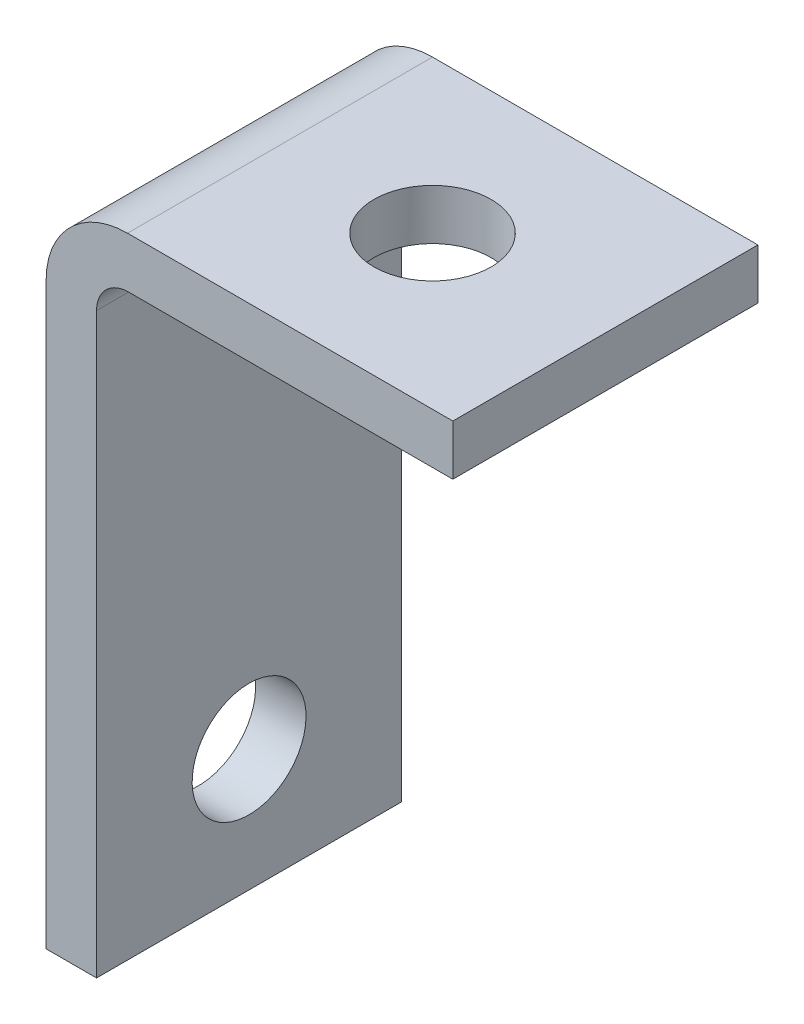
ISO-10303-21;
HEADER;
FILE_DESCRIPTION(('STEP AP214'),'2;1');
FILE_NAME('part.step','',(''),(''),'','','');
FILE_SCHEMA(('AUTOMOTIVE_DESIGN { 1 0 10303 214 1 1 1 1 }'));
ENDSEC;
DATA;
#1=APPLICATION_CONTEXT('core data for automotive mechanical design processes');
#2=APPLICATION_PROTOCOL_DEFINITION('international standard','automotive_design',2000,#1);
#3=PRODUCT_CONTEXT('',#1,'mechanical');
#4=PRODUCT('Part','Part','',(#3));
#5=PRODUCT_RELATED_PRODUCT_CATEGORY('part','',(#4));
#6=PRODUCT_DEFINITION_FORMATION('','',#4);
#7=PRODUCT_DEFINITION_CONTEXT('part definition',#1,'design');
#8=PRODUCT_DEFINITION('design','',#6,#7);
#9=PRODUCT_DEFINITION_SHAPE('','',#8);
#10=(LENGTH_UNIT() NAMED_UNIT(*) SI_UNIT(.MILLI.,.METRE.));
#11=(NAMED_UNIT(*) PLANE_ANGLE_UNIT() SI_UNIT($,.RADIAN.));
#12=(NAMED_UNIT(*) SI_UNIT($,.STERADIAN.) SOLID_ANGLE_UNIT());
#13=UNCERTAINTY_MEASURE_WITH_UNIT(LENGTH_MEASURE(1.E-05),#10,'distance_accuracy_value','');
#14=(GEOMETRIC_REPRESENTATION_CONTEXT(3) GLOBAL_UNCERTAINTY_ASSIGNED_CONTEXT((#13)) GLOBAL_UNIT_ASSIGNED_CONTEXT((#10,
#11,#12)) REPRESENTATION_CONTEXT('',''));
#15=CARTESIAN_POINT('',(0.,0.,0.));
#16=DIRECTION('',(0.,0.,1.));
#17=DIRECTION('',(1.,0.,0.));
#18=AXIS2_PLACEMENT_3D('',#15,#16,#17);
#19=CARTESIAN_POINT('',(1.5748,0.,9.525));
#20=DIRECTION('',(0.,1.,0.));
#21=DIRECTION('',(-1.,0.,0.));
#22=AXIS2_PLACEMENT_3D('',#19,#20,#21);
#23=PLANE('',#22);
#24=DIRECTION('',(1.,0.,0.));
#25=VECTOR('',#24,1.);
#26=CARTESIAN_POINT('',(1.5748,0.,0.));
#27=LINE('',#26,#25);
#28=CARTESIAN_POINT('',(0.,0.,0.));
#29=VERTEX_POINT('',#28);
#30=CARTESIAN_POINT('',(1.5748,0.,0.));
#31=VERTEX_POINT('',#30);
#32=EDGE_CURVE('E122',#29,#31,#27,.T.);
#33=ORIENTED_EDGE('',*,*,#32,.T.);
#34=DIRECTION('',(0.,0.,-1.));
#35=VECTOR('',#34,1.);
#36=CARTESIAN_POINT('',(1.5748,0.,9.525));
#37=LINE('',#36,#35);
#38=CARTESIAN_POINT('',(1.5748,0.,9.525));
#39=VERTEX_POINT('',#38);
#40=EDGE_CURVE('E103',#39,#31,#37,.T.);
#41=ORIENTED_EDGE('',*,*,#40,.F.);
#42=DIRECTION('',(1.,0.,0.));
#43=VECTOR('',#42,1.);
#44=CARTESIAN_POINT('',(1.5748,0.,9.525));
#45=LINE('',#44,#43);
#46=CARTESIAN_POINT('',(0.,0.,9.525));
#47=VERTEX_POINT('',#46);
#48=EDGE_CURVE('E110',#47,#39,#45,.T.);
#49=ORIENTED_EDGE('',*,*,#48,.F.);
#50=DIRECTION('',(0.,0.,-1.));
#51=VECTOR('',#50,1.);
#52=CARTESIAN_POINT('',(0.,0.,9.525));
#53=LINE('',#52,#51);
#54=EDGE_CURVE('E153',#47,#29,#53,.T.);
#55=ORIENTED_EDGE('',*,*,#54,.T.);
#56=EDGE_LOOP('',(#33,#41,#49,#55));
#57=FACE_BOUND('',#56,.T.);
#58=ADVANCED_FACE('F33',(#57),#23,.F.);
#59=CARTESIAN_POINT('',(1.5748,19.05,9.525));
#60=DIRECTION('',(-1.,0.,0.));
#61=DIRECTION('',(0.,-1.,0.));
#62=AXIS2_PLACEMENT_3D('',#59,#60,#61);
#63=PLANE('',#62);
#64=CARTESIAN_POINT('',(1.5748,3.81,4.7625));
#65=DIRECTION('',(1.,0.,0.));
#66=DIRECTION('',(0.,1.,0.));
#67=AXIS2_PLACEMENT_3D('',#64,#65,#66);
#68=CIRCLE('',#67,1.778);
#69=CARTESIAN_POINT('',(1.5748,5.588,4.7625));
#70=VERTEX_POINT('',#69);
#71=EDGE_CURVE('E174',#70,#70,#68,.T.);
#72=ORIENTED_EDGE('',*,*,#71,.F.);
#73=EDGE_LOOP('',(#72));
#74=FACE_BOUND('',#73,.T.);
#75=DIRECTION('',(0.,1.,0.));
#76=VECTOR('',#75,1.);
#77=CARTESIAN_POINT('',(1.5748,19.05,0.));
#78=LINE('',#77,#76);
#79=CARTESIAN_POINT('',(1.5748,18.05,0.));
#80=VERTEX_POINT('',#79);
#81=EDGE_CURVE('E163',#31,#80,#78,.T.);
#82=ORIENTED_EDGE('',*,*,#81,.T.);
#83=DIRECTION('',(0.,0.,-1.));
#84=VECTOR('',#83,1.);
#85=CARTESIAN_POINT('',(1.5748,18.05,9.525));
#86=LINE('',#85,#84);
#87=CARTESIAN_POINT('',(1.5748,18.05,9.525));
#88=VERTEX_POINT('',#87);
#89=EDGE_CURVE('E106',#80,#88,#86,.F.);
#90=ORIENTED_EDGE('',*,*,#89,.T.);
#91=DIRECTION('',(0.,1.,0.));
#92=VECTOR('',#91,1.);
#93=CARTESIAN_POINT('',(1.5748,19.05,9.525));
#94=LINE('',#93,#92);
#95=EDGE_CURVE('E98',#39,#88,#94,.T.);
#96=ORIENTED_EDGE('',*,*,#95,.F.);
#97=ORIENTED_EDGE('',*,*,#40,.T.);
#98=EDGE_LOOP('',(#82,#90,#96,#97));
#99=FACE_BOUND('',#98,.T.);
#100=ADVANCED_FACE('F101',(#74,#99),#63,.F.);
#101=CARTESIAN_POINT('',(12.7,19.05,9.525));
#102=DIRECTION('',(0.,1.,0.));
#103=DIRECTION('',(-1.,0.,0.));
#104=AXIS2_PLACEMENT_3D('',#101,#102,#103);
#105=PLANE('',#104);
#106=CARTESIAN_POINT('',(7.3025,19.05,4.7625));
#107=DIRECTION('',(0.,1.,0.));
#108=DIRECTION('',(-1.,0.,0.));
#109=AXIS2_PLACEMENT_3D('',#106,#107,#108);
#110=CIRCLE('',#109,1.8288);
#111=CARTESIAN_POINT('',(5.4737,19.05,4.7625));
#112=VERTEX_POINT('',#111);
#113=EDGE_CURVE('E177',#112,#112,#110,.T.);
#114=ORIENTED_EDGE('',*,*,#113,.T.);
#115=EDGE_LOOP('',(#114));
#116=FACE_BOUND('',#115,.T.);
#117=DIRECTION('',(1.,0.,0.));
#118=VECTOR('',#117,1.);
#119=CARTESIAN_POINT('',(12.7,19.05,9.525));
#120=LINE('',#119,#118);
#121=CARTESIAN_POINT('',(2.5748,19.05,9.525));
#122=VERTEX_POINT('',#121);
#123=CARTESIAN_POINT('',(12.7,19.05,9.525));
#124=VERTEX_POINT('',#123);
#125=EDGE_CURVE('E109',#122,#124,#120,.T.);
#126=ORIENTED_EDGE('',*,*,#125,.F.);
#127=DIRECTION('',(0.,0.,-1.));
#128=VECTOR('',#127,1.);
#129=CARTESIAN_POINT('',(2.5748,19.05,0.));
#130=LINE('',#129,#128);
#131=CARTESIAN_POINT('',(2.5748,19.05,0.));
#132=VERTEX_POINT('',#131);
#133=EDGE_CURVE('E123',#122,#132,#130,.T.);
#134=ORIENTED_EDGE('',*,*,#133,.T.);
#135=DIRECTION('',(1.,0.,0.));
#136=VECTOR('',#135,1.);
#137=CARTESIAN_POINT('',(12.7,19.05,0.));
#138=LINE('',#137,#136);
#139=CARTESIAN_POINT('',(12.7,19.05,0.));
#140=VERTEX_POINT('',#139);
#141=EDGE_CURVE('E162',#132,#140,#138,.T.);
#142=ORIENTED_EDGE('',*,*,#141,.T.);
#143=DIRECTION('',(0.,0.,-1.));
#144=VECTOR('',#143,1.);
#145=CARTESIAN_POINT('',(12.7,19.05,9.525));
#146=LINE('',#145,#144);
#147=EDGE_CURVE('E124',#124,#140,#146,.T.);
#148=ORIENTED_EDGE('',*,*,#147,.F.);
#149=EDGE_LOOP('',(#126,#134,#142,#148));
#150=FACE_BOUND('',#149,.T.);
#151=ADVANCED_FACE('F198',(#116,#150),#105,.F.);
#152=CARTESIAN_POINT('',(12.7,20.6248,9.525));
#153=DIRECTION('',(-1.,0.,0.));
#154=DIRECTION('',(0.,0.,1.));
#155=AXIS2_PLACEMENT_3D('',#152,#153,#154);
#156=PLANE('',#155);
#157=DIRECTION('',(0.,1.,0.));
#158=VECTOR('',#157,1.);
#159=CARTESIAN_POINT('',(12.7,20.6248,0.));
#160=LINE('',#159,#158);
#161=CARTESIAN_POINT('',(12.7,20.6248,0.));
#162=VERTEX_POINT('',#161);
#163=EDGE_CURVE('E149',#140,#162,#160,.T.);
#164=ORIENTED_EDGE('',*,*,#163,.T.);
#165=DIRECTION('',(0.,0.,-1.));
#166=VECTOR('',#165,1.);
#167=CARTESIAN_POINT('',(12.7,20.6248,9.525));
#168=LINE('',#167,#166);
#169=CARTESIAN_POINT('',(12.7,20.6248,9.525));
#170=VERTEX_POINT('',#169);
#171=EDGE_CURVE('E129',#170,#162,#168,.T.);
#172=ORIENTED_EDGE('',*,*,#171,.F.);
#173=DIRECTION('',(0.,1.,0.));
#174=VECTOR('',#173,1.);
#175=CARTESIAN_POINT('',(12.7,20.6248,9.525));
#176=LINE('',#175,#174);
#177=EDGE_CURVE('E171',#124,#170,#176,.T.);
#178=ORIENTED_EDGE('',*,*,#177,.F.);
#179=ORIENTED_EDGE('',*,*,#147,.T.);
#180=EDGE_LOOP('',(#164,#172,#178,#179));
#181=FACE_BOUND('',#180,.T.);
#182=ADVANCED_FACE('F190',(#181),#156,.F.);
#183=CARTESIAN_POINT('',(0.,20.6248,9.525));
#184=DIRECTION('',(0.,-1.,0.));
#185=DIRECTION('',(0.,0.,-1.));
#186=AXIS2_PLACEMENT_3D('',#183,#184,#185);
#187=PLANE('',#186);
#188=CARTESIAN_POINT('',(7.3025,20.6248,4.7625));
#189=DIRECTION('',(0.,1.,0.));
#190=DIRECTION('',(0.,0.,1.));
#191=AXIS2_PLACEMENT_3D('',#188,#189,#190);
#192=CIRCLE('',#191,1.8288);
#193=CARTESIAN_POINT('',(7.3025,20.6248,6.5913));
#194=VERTEX_POINT('',#193);
#195=EDGE_CURVE('E182',#194,#194,#192,.T.);
#196=ORIENTED_EDGE('',*,*,#195,.F.);
#197=EDGE_LOOP('',(#196));
#198=FACE_BOUND('',#197,.T.);
#199=DIRECTION('',(-1.,0.,0.));
#200=VECTOR('',#199,1.);
#201=CARTESIAN_POINT('',(0.,20.6248,0.));
#202=LINE('',#201,#200);
#203=CARTESIAN_POINT('',(2.54,20.6248,0.));
#204=VERTEX_POINT('',#203);
#205=EDGE_CURVE('E147',#162,#204,#202,.T.);
#206=ORIENTED_EDGE('',*,*,#205,.T.);
#207=DIRECTION('',(0.,0.,-1.));
#208=VECTOR('',#207,1.);
#209=CARTESIAN_POINT('',(2.54,20.6248,9.525));
#210=LINE('',#209,#208);
#211=CARTESIAN_POINT('',(2.54,20.6248,9.525));
#212=VERTEX_POINT('',#211);
#213=EDGE_CURVE('E41',#204,#212,#210,.F.);
#214=ORIENTED_EDGE('',*,*,#213,.T.);
#215=DIRECTION('',(-1.,0.,0.));
#216=VECTOR('',#215,1.);
#217=CARTESIAN_POINT('',(0.,20.6248,9.525));
#218=LINE('',#217,#216);
#219=EDGE_CURVE('E157',#170,#212,#218,.T.);
#220=ORIENTED_EDGE('',*,*,#219,.F.);
#221=ORIENTED_EDGE('',*,*,#171,.T.);
#222=EDGE_LOOP('',(#206,#214,#220,#221));
#223=FACE_BOUND('',#222,.T.);
#224=ADVANCED_FACE('F156',(#198,#223),#187,.F.);
#225=CARTESIAN_POINT('',(0.,0.,9.525));
#226=DIRECTION('',(1.,0.,0.));
#227=DIRECTION('',(0.,0.,-1.));
#228=AXIS2_PLACEMENT_3D('',#225,#226,#227);
#229=PLANE('',#228);
#230=CARTESIAN_POINT('',(0.,3.81,4.7625));
#231=DIRECTION('',(1.,0.,0.));
#232=DIRECTION('',(0.,1.,0.));
#233=AXIS2_PLACEMENT_3D('',#230,#231,#232);
#234=CIRCLE('',#233,1.778);
#235=CARTESIAN_POINT('',(0.,5.588,4.7625));
#236=VERTEX_POINT('',#235);
#237=EDGE_CURVE('E168',#236,#236,#234,.T.);
#238=ORIENTED_EDGE('',*,*,#237,.T.);
#239=EDGE_LOOP('',(#238));
#240=FACE_BOUND('',#239,.T.);
#241=DIRECTION('',(0.,-1.,0.));
#242=VECTOR('',#241,1.);
#243=CARTESIAN_POINT('',(0.,0.,9.525));
#244=LINE('',#243,#242);
#245=CARTESIAN_POINT('',(0.,18.0848,9.525));
#246=VERTEX_POINT('',#245);
#247=EDGE_CURVE('E115',#246,#47,#244,.T.);
#248=ORIENTED_EDGE('',*,*,#247,.F.);
#249=DIRECTION('',(0.,0.,-1.));
#250=VECTOR('',#249,1.);
#251=CARTESIAN_POINT('',(0.,18.0848,9.525));
#252=LINE('',#251,#250);
#253=CARTESIAN_POINT('',(0.,18.0848,0.));
#254=VERTEX_POINT('',#253);
#255=EDGE_CURVE('E138',#246,#254,#252,.T.);
#256=ORIENTED_EDGE('',*,*,#255,.T.);
#257=DIRECTION('',(0.,-1.,0.));
#258=VECTOR('',#257,1.);
#259=CARTESIAN_POINT('',(0.,0.,0.));
#260=LINE('',#259,#258);
#261=EDGE_CURVE('E119',#254,#29,#260,.T.);
#262=ORIENTED_EDGE('',*,*,#261,.T.);
#263=ORIENTED_EDGE('',*,*,#54,.F.);
#264=EDGE_LOOP('',(#248,#256,#262,#263));
#265=FACE_BOUND('',#264,.T.);
#266=ADVANCED_FACE('F143',(#240,#265),#229,.F.);
#267=CARTESIAN_POINT('',(0.,0.,9.525));
#268=DIRECTION('',(0.,0.,-1.));
#269=DIRECTION('',(-1.,0.,0.));
#270=AXIS2_PLACEMENT_3D('',#267,#268,#269);
#271=PLANE('',#270);
#272=ORIENTED_EDGE('',*,*,#219,.T.);
#273=CARTESIAN_POINT('',(2.54,18.0848,9.525));
#274=DIRECTION('',(0.,0.,-1.));
#275=DIRECTION('',(-1.,0.,0.));
#276=AXIS2_PLACEMENT_3D('',#273,#274,#275);
#277=CIRCLE('',#276,2.54);
#278=EDGE_CURVE('E11',#212,#246,#277,.F.);
#279=ORIENTED_EDGE('',*,*,#278,.T.);
#280=ORIENTED_EDGE('',*,*,#247,.T.);
#281=ORIENTED_EDGE('',*,*,#48,.T.);
#282=ORIENTED_EDGE('',*,*,#95,.T.);
#283=CARTESIAN_POINT('',(2.5748,18.05,9.525));
#284=DIRECTION('',(0.,0.,-1.));
#285=DIRECTION('',(-1.,0.,0.));
#286=AXIS2_PLACEMENT_3D('',#283,#284,#285);
#287=CIRCLE('',#286,1.);
#288=EDGE_CURVE('E136',#88,#122,#287,.T.);
#289=ORIENTED_EDGE('',*,*,#288,.T.);
#290=ORIENTED_EDGE('',*,*,#125,.T.);
#291=ORIENTED_EDGE('',*,*,#177,.T.);
#292=EDGE_LOOP('',(#272,#279,#280,#281,#282,#289,#290,#291));
#293=FACE_BOUND('',#292,.T.);
#294=ADVANCED_FACE('F113',(#293),#271,.F.);
#295=CARTESIAN_POINT('',(0.,0.,0.));
#296=DIRECTION('',(0.,0.,-1.));
#297=DIRECTION('',(-1.,0.,0.));
#298=AXIS2_PLACEMENT_3D('',#295,#296,#297);
#299=PLANE('',#298);
#300=ORIENTED_EDGE('',*,*,#261,.F.);
#301=CARTESIAN_POINT('',(2.54,18.0848,0.));
#302=DIRECTION('',(0.,0.,-1.));
#303=DIRECTION('',(-1.,0.,0.));
#304=AXIS2_PLACEMENT_3D('',#301,#302,#303);
#305=CIRCLE('',#304,2.54);
#306=EDGE_CURVE('E55',#254,#204,#305,.T.);
#307=ORIENTED_EDGE('',*,*,#306,.T.);
#308=ORIENTED_EDGE('',*,*,#205,.F.);
#309=ORIENTED_EDGE('',*,*,#163,.F.);
#310=ORIENTED_EDGE('',*,*,#141,.F.);
#311=CARTESIAN_POINT('',(2.5748,18.05,0.));
#312=DIRECTION('',(0.,0.,-1.));
#313=DIRECTION('',(-1.,0.,0.));
#314=AXIS2_PLACEMENT_3D('',#311,#312,#313);
#315=CIRCLE('',#314,1.);
#316=EDGE_CURVE('E134',#132,#80,#315,.F.);
#317=ORIENTED_EDGE('',*,*,#316,.T.);
#318=ORIENTED_EDGE('',*,*,#81,.F.);
#319=ORIENTED_EDGE('',*,*,#32,.F.);
#320=EDGE_LOOP('',(#300,#307,#308,#309,#310,#317,#318,#319));
#321=FACE_BOUND('',#320,.T.);
#322=ADVANCED_FACE('F146',(#321),#299,.T.);
#323=CARTESIAN_POINT('',(2.5748,18.05,9.525));
#324=DIRECTION('',(0.,0.,1.));
#325=DIRECTION('',(1.,0.,0.));
#326=AXIS2_PLACEMENT_3D('',#323,#324,#325);
#327=CYLINDRICAL_SURFACE('',#326,1.);
#328=ORIENTED_EDGE('',*,*,#288,.F.);
#329=ORIENTED_EDGE('',*,*,#89,.F.);
#330=ORIENTED_EDGE('',*,*,#316,.F.);
#331=ORIENTED_EDGE('',*,*,#133,.F.);
#332=EDGE_LOOP('',(#328,#329,#330,#331));
#333=FACE_BOUND('',#332,.T.);
#334=ADVANCED_FACE('F208',(#333),#327,.F.);
#335=CARTESIAN_POINT('',(2.54,18.0848,9.525));
#336=DIRECTION('',(0.,0.,-1.));
#337=DIRECTION('',(-1.,0.,0.));
#338=AXIS2_PLACEMENT_3D('',#335,#336,#337);
#339=CYLINDRICAL_SURFACE('',#338,2.54);
#340=ORIENTED_EDGE('',*,*,#278,.F.);
#341=ORIENTED_EDGE('',*,*,#213,.F.);
#342=ORIENTED_EDGE('',*,*,#306,.F.);
#343=ORIENTED_EDGE('',*,*,#255,.F.);
#344=EDGE_LOOP('',(#340,#341,#342,#343));
#345=FACE_BOUND('',#344,.T.);
#346=ADVANCED_FACE('F35',(#345),#339,.T.);
#347=CARTESIAN_POINT('',(0.,3.81,4.7625));
#348=DIRECTION('',(1.,0.,0.));
#349=DIRECTION('',(0.,1.,0.));
#350=AXIS2_PLACEMENT_3D('',#347,#348,#349);
#351=CYLINDRICAL_SURFACE('',#350,1.778);
#352=ORIENTED_EDGE('',*,*,#237,.F.);
#353=EDGE_LOOP('',(#352));
#354=FACE_BOUND('',#353,.T.);
#355=ORIENTED_EDGE('',*,*,#71,.T.);
#356=EDGE_LOOP('',(#355));
#357=FACE_BOUND('',#356,.T.);
#358=ADVANCED_FACE('F215',(#354,#357),#351,.F.);
#359=CARTESIAN_POINT('',(7.3025,0.,4.7625));
#360=DIRECTION('',(0.,1.,0.));
#361=DIRECTION('',(0.,0.,1.));
#362=AXIS2_PLACEMENT_3D('',#359,#360,#361);
#363=CYLINDRICAL_SURFACE('',#362,1.8288);
#364=ORIENTED_EDGE('',*,*,#195,.T.);
#365=EDGE_LOOP('',(#364));
#366=FACE_BOUND('',#365,.T.);
#367=ORIENTED_EDGE('',*,*,#113,.F.);
#368=EDGE_LOOP('',(#367));
#369=FACE_BOUND('',#368,.T.);
#370=ADVANCED_FACE('F186',(#366,#369),#363,.F.);
#371=CLOSED_SHELL('',(#58,#100,#151,#182,#224,#266,#294,#322,#334,#346,#358,#370));
#372=MANIFOLD_SOLID_BREP('B2',#371);
#373=ADVANCED_BREP_SHAPE_REPRESENTATION('',(#18,#372),#14);
#374=SHAPE_DEFINITION_REPRESENTATION(#9,#373);
ENDSEC;
END-ISO-10303-21;
